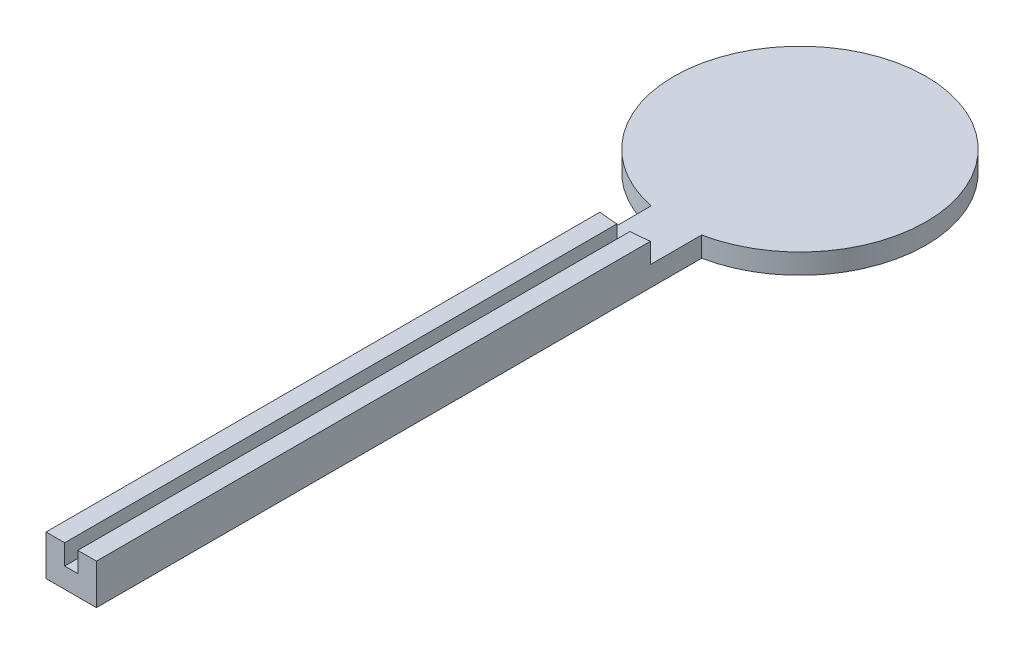
ISO-10303-21;
HEADER;
FILE_DESCRIPTION(('STEP AP214'),'2;1');
FILE_NAME('part.step','',(''),(''),'','','');
FILE_SCHEMA(('AUTOMOTIVE_DESIGN { 1 0 10303 214 1 1 1 1 }'));
ENDSEC;
DATA;
#1=APPLICATION_CONTEXT('core data for automotive mechanical design processes');
#2=APPLICATION_PROTOCOL_DEFINITION('international standard','automotive_design',2000,#1);
#3=PRODUCT_CONTEXT('',#1,'mechanical');
#4=PRODUCT('Part','Part','',(#3));
#5=PRODUCT_RELATED_PRODUCT_CATEGORY('part','',(#4));
#6=PRODUCT_DEFINITION_FORMATION('','',#4);
#7=PRODUCT_DEFINITION_CONTEXT('part definition',#1,'design');
#8=PRODUCT_DEFINITION('design','',#6,#7);
#9=PRODUCT_DEFINITION_SHAPE('','',#8);
#10=(LENGTH_UNIT() NAMED_UNIT(*) SI_UNIT(.MILLI.,.METRE.));
#11=(NAMED_UNIT(*) PLANE_ANGLE_UNIT() SI_UNIT($,.RADIAN.));
#12=(NAMED_UNIT(*) SI_UNIT($,.STERADIAN.) SOLID_ANGLE_UNIT());
#13=UNCERTAINTY_MEASURE_WITH_UNIT(LENGTH_MEASURE(1.E-05),#10,'distance_accuracy_value','');
#14=(GEOMETRIC_REPRESENTATION_CONTEXT(3) GLOBAL_UNCERTAINTY_ASSIGNED_CONTEXT((#13)) GLOBAL_UNIT_ASSIGNED_CONTEXT((#10,
#11,#12)) REPRESENTATION_CONTEXT('',''));
#15=CARTESIAN_POINT('',(0.,0.,0.));
#16=DIRECTION('',(0.,0.,1.));
#17=DIRECTION('',(1.,0.,0.));
#18=AXIS2_PLACEMENT_3D('',#15,#16,#17);
#19=CARTESIAN_POINT('',(0.,4.,0.));
#20=DIRECTION('',(0.,1.,0.));
#21=DIRECTION('',(0.,0.,1.));
#22=AXIS2_PLACEMENT_3D('',#19,#20,#21);
#23=PLANE('',#22);
#24=DIRECTION('',(0.,0.,-1.));
#25=VECTOR('',#24,1.);
#26=CARTESIAN_POINT('',(0.65,4.,72.2474487139159));
#27=LINE('',#26,#25);
#28=CARTESIAN_POINT('',(0.65,4.,72.2474487139159));
#29=VERTEX_POINT('',#28);
#30=CARTESIAN_POINT('',(0.65,4.,17.4879244051431));
#31=VERTEX_POINT('',#30);
#32=EDGE_CURVE('E124',#29,#31,#27,.T.);
#33=ORIENTED_EDGE('',*,*,#32,.F.);
#34=DIRECTION('',(1.,0.,0.));
#35=VECTOR('',#34,1.);
#36=CARTESIAN_POINT('',(2.5,4.,72.2474487139159));
#37=LINE('',#36,#35);
#38=CARTESIAN_POINT('',(2.5,4.,72.2474487139159));
#39=VERTEX_POINT('',#38);
#40=EDGE_CURVE('E151',#29,#39,#37,.T.);
#41=ORIENTED_EDGE('',*,*,#40,.T.);
#42=DIRECTION('',(0.,0.,-1.));
#43=VECTOR('',#42,1.);
#44=CARTESIAN_POINT('',(2.5,4.,72.2474487139159));
#45=LINE('',#44,#43);
#46=CARTESIAN_POINT('',(2.5,4.,17.3205080756888));
#47=VERTEX_POINT('',#46);
#48=EDGE_CURVE('E145',#39,#47,#45,.T.);
#49=ORIENTED_EDGE('',*,*,#48,.T.);
#50=CARTESIAN_POINT('',(0.,4.,0.));
#51=DIRECTION('',(0.,1.,0.));
#52=DIRECTION('',(0.,0.,1.));
#53=AXIS2_PLACEMENT_3D('',#50,#51,#52);
#54=CIRCLE('',#53,17.5);
#55=EDGE_CURVE('E172',#31,#47,#54,.T.);
#56=ORIENTED_EDGE('',*,*,#55,.F.);
#57=EDGE_LOOP('',(#33,#41,#49,#56));
#58=FACE_BOUND('',#57,.T.);
#59=ADVANCED_FACE('F37',(#58),#23,.T.);
#60=CARTESIAN_POINT('',(0.,2.,0.));
#61=DIRECTION('',(0.,1.,0.));
#62=DIRECTION('',(0.,0.,1.));
#63=AXIS2_PLACEMENT_3D('',#60,#61,#62);
#64=CYLINDRICAL_SURFACE('',#63,17.5);
#65=CARTESIAN_POINT('',(0.,2.,0.));
#66=DIRECTION('',(0.,1.,0.));
#67=DIRECTION('',(0.,0.,1.));
#68=AXIS2_PLACEMENT_3D('',#65,#66,#67);
#69=CIRCLE('',#68,17.5);
#70=CARTESIAN_POINT('',(0.65,2.,17.4879244051431));
#71=VERTEX_POINT('',#70);
#72=CARTESIAN_POINT('',(2.5,2.,17.3205080756888));
#73=VERTEX_POINT('',#72);
#74=EDGE_CURVE('E131',#71,#73,#69,.T.);
#75=ORIENTED_EDGE('',*,*,#74,.F.);
#76=DIRECTION('',(0.,1.,0.));
#77=VECTOR('',#76,1.);
#78=CARTESIAN_POINT('',(0.65,2.,17.4879244051431));
#79=LINE('',#78,#77);
#80=EDGE_CURVE('E135',#71,#31,#79,.T.);
#81=ORIENTED_EDGE('',*,*,#80,.T.);
#82=ORIENTED_EDGE('',*,*,#55,.T.);
#83=DIRECTION('',(0.,1.,0.));
#84=VECTOR('',#83,1.);
#85=CARTESIAN_POINT('',(2.5,2.,17.3205080756888));
#86=LINE('',#85,#84);
#87=EDGE_CURVE('E133',#73,#47,#86,.T.);
#88=ORIENTED_EDGE('',*,*,#87,.F.);
#89=EDGE_LOOP('',(#75,#81,#82,#88));
#90=FACE_BOUND('',#89,.T.);
#91=ADVANCED_FACE('F178',(#90),#64,.F.);
#92=CARTESIAN_POINT('',(0.,4.,0.));
#93=DIRECTION('',(0.,-1.,0.));
#94=DIRECTION('',(0.,0.,-1.));
#95=AXIS2_PLACEMENT_3D('',#92,#93,#94);
#96=CYLINDRICAL_SURFACE('',#95,12.5);
#97=CARTESIAN_POINT('',(0.,2.,0.));
#98=DIRECTION('',(0.,1.,0.));
#99=DIRECTION('',(0.,0.,1.));
#100=AXIS2_PLACEMENT_3D('',#97,#98,#99);
#101=CIRCLE('',#100,12.5);
#102=CARTESIAN_POINT('',(2.5,2.,12.2474487139159));
#103=VERTEX_POINT('',#102);
#104=CARTESIAN_POINT('',(-2.5,2.,12.2474487139159));
#105=VERTEX_POINT('',#104);
#106=EDGE_CURVE('E140',#103,#105,#101,.T.);
#107=ORIENTED_EDGE('',*,*,#106,.F.);
#108=DIRECTION('',(0.,-1.,0.));
#109=VECTOR('',#108,1.);
#110=CARTESIAN_POINT('',(2.5,4.,12.2474487139159));
#111=LINE('',#110,#109);
#112=CARTESIAN_POINT('',(2.5,0.,12.2474487139159));
#113=VERTEX_POINT('',#112);
#114=EDGE_CURVE('E171',#103,#113,#111,.T.);
#115=ORIENTED_EDGE('',*,*,#114,.T.);
#116=CARTESIAN_POINT('',(0.,0.,0.));
#117=DIRECTION('',(0.,1.,0.));
#118=DIRECTION('',(0.,0.,1.));
#119=AXIS2_PLACEMENT_3D('',#116,#117,#118);
#120=CIRCLE('',#119,12.5);
#121=CARTESIAN_POINT('',(-2.5,0.,12.2474487139159));
#122=VERTEX_POINT('',#121);
#123=EDGE_CURVE('E158',#113,#122,#120,.T.);
#124=ORIENTED_EDGE('',*,*,#123,.T.);
#125=DIRECTION('',(0.,-1.,0.));
#126=VECTOR('',#125,1.);
#127=CARTESIAN_POINT('',(-2.5,4.,12.2474487139159));
#128=LINE('',#127,#126);
#129=EDGE_CURVE('E169',#105,#122,#128,.T.);
#130=ORIENTED_EDGE('',*,*,#129,.F.);
#131=EDGE_LOOP('',(#107,#115,#124,#130));
#132=FACE_BOUND('',#131,.T.);
#133=ADVANCED_FACE('F199',(#132),#96,.T.);
#134=CARTESIAN_POINT('',(2.5,4.,72.2474487139159));
#135=DIRECTION('',(-1.,0.,0.));
#136=DIRECTION('',(0.,0.,1.));
#137=AXIS2_PLACEMENT_3D('',#134,#135,#136);
#138=PLANE('',#137);
#139=DIRECTION('',(0.,0.,-1.));
#140=VECTOR('',#139,1.);
#141=CARTESIAN_POINT('',(2.5,2.,72.2474487139159));
#142=LINE('',#141,#140);
#143=EDGE_CURVE('E142',#73,#103,#142,.T.);
#144=ORIENTED_EDGE('',*,*,#143,.F.);
#145=ORIENTED_EDGE('',*,*,#87,.T.);
#146=ORIENTED_EDGE('',*,*,#48,.F.);
#147=DIRECTION('',(0.,-1.,0.));
#148=VECTOR('',#147,1.);
#149=CARTESIAN_POINT('',(2.5,4.,72.2474487139159));
#150=LINE('',#149,#148);
#151=CARTESIAN_POINT('',(2.5,0.,72.2474487139159));
#152=VERTEX_POINT('',#151);
#153=EDGE_CURVE('E155',#39,#152,#150,.T.);
#154=ORIENTED_EDGE('',*,*,#153,.T.);
#155=DIRECTION('',(0.,0.,-1.));
#156=VECTOR('',#155,1.);
#157=CARTESIAN_POINT('',(2.5,0.,72.2474487139159));
#158=LINE('',#157,#156);
#159=EDGE_CURVE('E144',#152,#113,#158,.T.);
#160=ORIENTED_EDGE('',*,*,#159,.T.);
#161=ORIENTED_EDGE('',*,*,#114,.F.);
#162=EDGE_LOOP('',(#144,#145,#146,#154,#160,#161));
#163=FACE_BOUND('',#162,.T.);
#164=ADVANCED_FACE('F39',(#163),#138,.F.);
#165=CARTESIAN_POINT('',(-2.5,4.,72.2474487139159));
#166=DIRECTION('',(1.,0.,0.));
#167=DIRECTION('',(0.,0.,-1.));
#168=AXIS2_PLACEMENT_3D('',#165,#166,#167);
#169=PLANE('',#168);
#170=DIRECTION('',(0.,0.,1.));
#171=VECTOR('',#170,1.);
#172=CARTESIAN_POINT('',(-2.5,4.,72.2474487139159));
#173=LINE('',#172,#171);
#174=CARTESIAN_POINT('',(-2.5,4.,17.3205080756888));
#175=VERTEX_POINT('',#174);
#176=CARTESIAN_POINT('',(-2.5,4.,72.2474487139159));
#177=VERTEX_POINT('',#176);
#178=EDGE_CURVE('E148',#175,#177,#173,.T.);
#179=ORIENTED_EDGE('',*,*,#178,.F.);
#180=DIRECTION('',(0.,1.,0.));
#181=VECTOR('',#180,1.);
#182=CARTESIAN_POINT('',(-2.5,2.,17.3205080756888));
#183=LINE('',#182,#181);
#184=CARTESIAN_POINT('',(-2.5,2.,17.3205080756888));
#185=VERTEX_POINT('',#184);
#186=EDGE_CURVE('E60',#175,#185,#183,.F.);
#187=ORIENTED_EDGE('',*,*,#186,.T.);
#188=DIRECTION('',(0.,0.,1.));
#189=VECTOR('',#188,1.);
#190=CARTESIAN_POINT('',(-2.5,2.,72.2474487139159));
#191=LINE('',#190,#189);
#192=EDGE_CURVE('E11',#105,#185,#191,.T.);
#193=ORIENTED_EDGE('',*,*,#192,.F.);
#194=ORIENTED_EDGE('',*,*,#129,.T.);
#195=DIRECTION('',(0.,0.,1.));
#196=VECTOR('',#195,1.);
#197=CARTESIAN_POINT('',(-2.5,0.,72.2474487139159));
#198=LINE('',#197,#196);
#199=CARTESIAN_POINT('',(-2.5,0.,72.2474487139159));
#200=VERTEX_POINT('',#199);
#201=EDGE_CURVE('E161',#122,#200,#198,.T.);
#202=ORIENTED_EDGE('',*,*,#201,.T.);
#203=DIRECTION('',(0.,-1.,0.));
#204=VECTOR('',#203,1.);
#205=CARTESIAN_POINT('',(-2.5,4.,72.2474487139159));
#206=LINE('',#205,#204);
#207=EDGE_CURVE('E166',#177,#200,#206,.T.);
#208=ORIENTED_EDGE('',*,*,#207,.F.);
#209=EDGE_LOOP('',(#179,#187,#193,#194,#202,#208));
#210=FACE_BOUND('',#209,.T.);
#211=ADVANCED_FACE('F202',(#210),#169,.F.);
#212=CARTESIAN_POINT('',(2.5,4.,72.2474487139159));
#213=DIRECTION('',(0.,0.,-1.));
#214=DIRECTION('',(-1.,0.,0.));
#215=AXIS2_PLACEMENT_3D('',#212,#213,#214);
#216=PLANE('',#215);
#217=ORIENTED_EDGE('',*,*,#40,.F.);
#218=DIRECTION('',(0.,1.,0.));
#219=VECTOR('',#218,1.);
#220=CARTESIAN_POINT('',(0.65,2.,72.2474487139159));
#221=LINE('',#220,#219);
#222=CARTESIAN_POINT('',(0.65,2.,72.2474487139159));
#223=VERTEX_POINT('',#222);
#224=EDGE_CURVE('E214',#223,#29,#221,.T.);
#225=ORIENTED_EDGE('',*,*,#224,.F.);
#226=DIRECTION('',(1.,0.,0.));
#227=VECTOR('',#226,1.);
#228=CARTESIAN_POINT('',(-0.65,2.,72.2474487139159));
#229=LINE('',#228,#227);
#230=CARTESIAN_POINT('',(-0.65,2.,72.2474487139159));
#231=VERTEX_POINT('',#230);
#232=EDGE_CURVE('E123',#231,#223,#229,.T.);
#233=ORIENTED_EDGE('',*,*,#232,.F.);
#234=DIRECTION('',(0.,1.,0.));
#235=VECTOR('',#234,1.);
#236=CARTESIAN_POINT('',(-0.65,2.,72.2474487139159));
#237=LINE('',#236,#235);
#238=CARTESIAN_POINT('',(-0.65,4.,72.2474487139159));
#239=VERTEX_POINT('',#238);
#240=EDGE_CURVE('E120',#231,#239,#237,.T.);
#241=ORIENTED_EDGE('',*,*,#240,.T.);
#242=EDGE_CURVE('E152',#177,#239,#37,.T.);
#243=ORIENTED_EDGE('',*,*,#242,.F.);
#244=ORIENTED_EDGE('',*,*,#207,.T.);
#245=DIRECTION('',(1.,0.,0.));
#246=VECTOR('',#245,1.);
#247=CARTESIAN_POINT('',(2.5,0.,72.2474487139159));
#248=LINE('',#247,#246);
#249=EDGE_CURVE('E149',#200,#152,#248,.T.);
#250=ORIENTED_EDGE('',*,*,#249,.T.);
#251=ORIENTED_EDGE('',*,*,#153,.F.);
#252=EDGE_LOOP('',(#217,#225,#233,#241,#243,#244,#250,#251));
#253=FACE_BOUND('',#252,.T.);
#254=ADVANCED_FACE('F189',(#253),#216,.F.);
#255=DIRECTION('',(0.,0.,1.));
#256=VECTOR('',#255,1.);
#257=CARTESIAN_POINT('',(-0.650000000000007,4.,17.4879244051431));
#258=LINE('',#257,#256);
#259=CARTESIAN_POINT('',(-0.650000000000007,4.,17.4879244051431));
#260=VERTEX_POINT('',#259);
#261=EDGE_CURVE('E207',#260,#239,#258,.T.);
#262=ORIENTED_EDGE('',*,*,#261,.F.);
#263=EDGE_CURVE('E45',#175,#260,#54,.T.);
#264=ORIENTED_EDGE('',*,*,#263,.F.);
#265=ORIENTED_EDGE('',*,*,#178,.T.);
#266=ORIENTED_EDGE('',*,*,#242,.T.);
#267=EDGE_LOOP('',(#262,#264,#265,#266));
#268=FACE_BOUND('',#267,.T.);
#269=ADVANCED_FACE('F206',(#268),#23,.T.);
#270=CARTESIAN_POINT('',(0.,0.,0.));
#271=DIRECTION('',(0.,1.,0.));
#272=DIRECTION('',(0.,0.,1.));
#273=AXIS2_PLACEMENT_3D('',#270,#271,#272);
#274=PLANE('',#273);
#275=ORIENTED_EDGE('',*,*,#159,.F.);
#276=ORIENTED_EDGE('',*,*,#249,.F.);
#277=ORIENTED_EDGE('',*,*,#201,.F.);
#278=ORIENTED_EDGE('',*,*,#123,.F.);
#279=EDGE_LOOP('',(#275,#276,#277,#278));
#280=FACE_BOUND('',#279,.T.);
#281=ADVANCED_FACE('F194',(#280),#274,.F.);
#282=CARTESIAN_POINT('',(0.,2.,0.));
#283=DIRECTION('',(0.,1.,0.));
#284=DIRECTION('',(0.,0.,1.));
#285=AXIS2_PLACEMENT_3D('',#282,#283,#284);
#286=PLANE('',#285);
#287=ORIENTED_EDGE('',*,*,#143,.T.);
#288=ORIENTED_EDGE('',*,*,#106,.T.);
#289=ORIENTED_EDGE('',*,*,#192,.T.);
#290=CARTESIAN_POINT('',(-0.650000000000007,2.,17.4879244051431));
#291=VERTEX_POINT('',#290);
#292=EDGE_CURVE('E127',#185,#291,#69,.T.);
#293=ORIENTED_EDGE('',*,*,#292,.T.);
#294=DIRECTION('',(0.,0.,1.));
#295=VECTOR('',#294,1.);
#296=CARTESIAN_POINT('',(-0.650000000000007,2.,17.4879244051431));
#297=LINE('',#296,#295);
#298=EDGE_CURVE('E114',#291,#231,#297,.T.);
#299=ORIENTED_EDGE('',*,*,#298,.T.);
#300=ORIENTED_EDGE('',*,*,#232,.T.);
#301=DIRECTION('',(0.,0.,-1.));
#302=VECTOR('',#301,1.);
#303=CARTESIAN_POINT('',(0.65,2.,72.2474487139159));
#304=LINE('',#303,#302);
#305=EDGE_CURVE('E52',#223,#71,#304,.T.);
#306=ORIENTED_EDGE('',*,*,#305,.T.);
#307=ORIENTED_EDGE('',*,*,#74,.T.);
#308=EDGE_LOOP('',(#287,#288,#289,#293,#299,#300,#306,#307));
#309=FACE_BOUND('',#308,.T.);
#310=ADVANCED_FACE('F129',(#309),#286,.T.);
#311=ORIENTED_EDGE('',*,*,#263,.T.);
#312=DIRECTION('',(0.,1.,0.));
#313=VECTOR('',#312,1.);
#314=CARTESIAN_POINT('',(-0.650000000000007,2.,17.4879244051431));
#315=LINE('',#314,#313);
#316=EDGE_CURVE('E117',#291,#260,#315,.T.);
#317=ORIENTED_EDGE('',*,*,#316,.F.);
#318=ORIENTED_EDGE('',*,*,#292,.F.);
#319=ORIENTED_EDGE('',*,*,#186,.F.);
#320=EDGE_LOOP('',(#311,#317,#318,#319));
#321=FACE_BOUND('',#320,.T.);
#322=ADVANCED_FACE('F126',(#321),#64,.F.);
#323=CARTESIAN_POINT('',(0.65,2.,72.2474487139159));
#324=DIRECTION('',(1.,0.,0.));
#325=DIRECTION('',(0.,0.,-1.));
#326=AXIS2_PLACEMENT_3D('',#323,#324,#325);
#327=PLANE('',#326);
#328=ORIENTED_EDGE('',*,*,#32,.T.);
#329=ORIENTED_EDGE('',*,*,#80,.F.);
#330=ORIENTED_EDGE('',*,*,#305,.F.);
#331=ORIENTED_EDGE('',*,*,#224,.T.);
#332=EDGE_LOOP('',(#328,#329,#330,#331));
#333=FACE_BOUND('',#332,.T.);
#334=ADVANCED_FACE('F216',(#333),#327,.F.);
#335=CARTESIAN_POINT('',(-0.650000000000007,2.,17.4879244051431));
#336=DIRECTION('',(-1.,0.,0.));
#337=DIRECTION('',(0.,0.,1.));
#338=AXIS2_PLACEMENT_3D('',#335,#336,#337);
#339=PLANE('',#338);
#340=ORIENTED_EDGE('',*,*,#261,.T.);
#341=ORIENTED_EDGE('',*,*,#240,.F.);
#342=ORIENTED_EDGE('',*,*,#298,.F.);
#343=ORIENTED_EDGE('',*,*,#316,.T.);
#344=EDGE_LOOP('',(#340,#341,#342,#343));
#345=FACE_BOUND('',#344,.T.);
#346=ADVANCED_FACE('F116',(#345),#339,.F.);
#347=CLOSED_SHELL('',(#59,#91,#133,#164,#211,#254,#269,#281,#310,#322,#334,#346));
#348=MANIFOLD_SOLID_BREP('B2',#347);
#349=ADVANCED_BREP_SHAPE_REPRESENTATION('',(#18,#348),#14);
#350=SHAPE_DEFINITION_REPRESENTATION(#9,#349);
ENDSEC;
END-ISO-10303-21;
